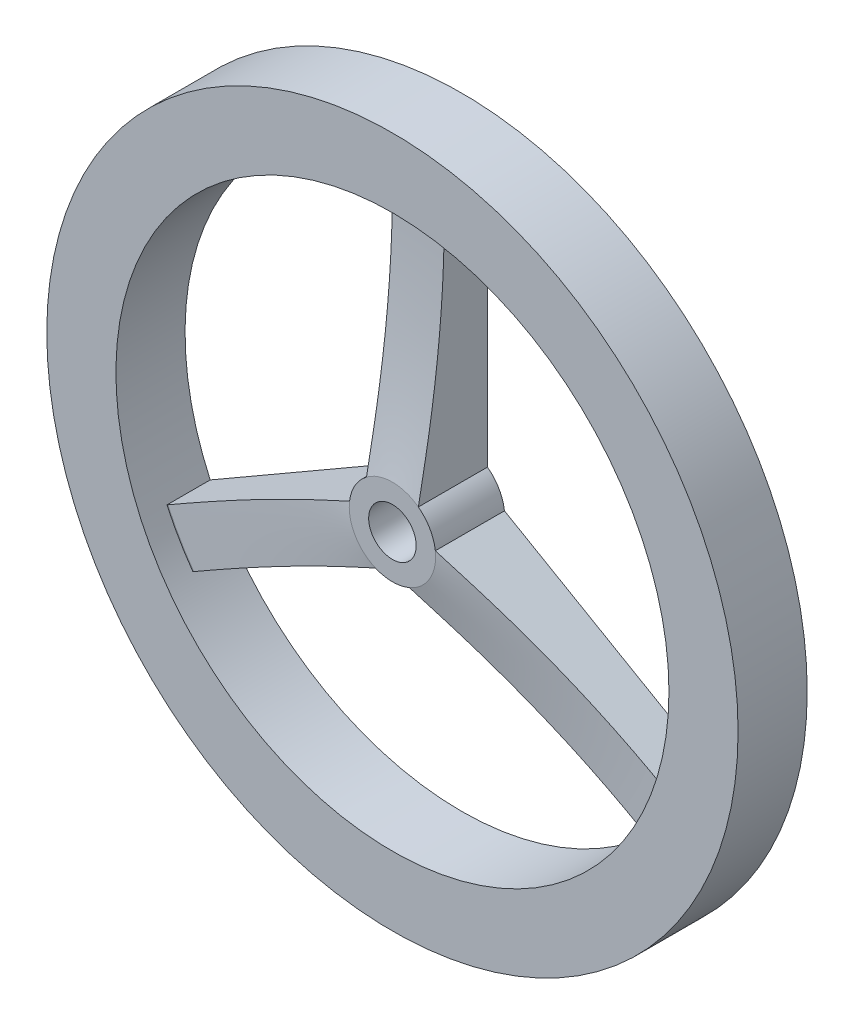
ISO-10303-21;
HEADER;
FILE_DESCRIPTION(('STEP AP214'),'2;1');
FILE_NAME('part.step','',(''),(''),'','','');
FILE_SCHEMA(('AUTOMOTIVE_DESIGN { 1 0 10303 214 1 1 1 1 }'));
ENDSEC;
DATA;
#1=APPLICATION_CONTEXT('core data for automotive mechanical design processes');
#2=APPLICATION_PROTOCOL_DEFINITION('international standard','automotive_design',2000,#1);
#3=PRODUCT_CONTEXT('',#1,'mechanical');
#4=PRODUCT('Part','Part','',(#3));
#5=PRODUCT_RELATED_PRODUCT_CATEGORY('part','',(#4));
#6=PRODUCT_DEFINITION_FORMATION('','',#4);
#7=PRODUCT_DEFINITION_CONTEXT('part definition',#1,'design');
#8=PRODUCT_DEFINITION('design','',#6,#7);
#9=PRODUCT_DEFINITION_SHAPE('','',#8);
#10=(LENGTH_UNIT() NAMED_UNIT(*) SI_UNIT(.MILLI.,.METRE.));
#11=(NAMED_UNIT(*) PLANE_ANGLE_UNIT() SI_UNIT($,.RADIAN.));
#12=(NAMED_UNIT(*) SI_UNIT($,.STERADIAN.) SOLID_ANGLE_UNIT());
#13=UNCERTAINTY_MEASURE_WITH_UNIT(LENGTH_MEASURE(1.E-05),#10,'distance_accuracy_value','');
#14=(GEOMETRIC_REPRESENTATION_CONTEXT(3) GLOBAL_UNCERTAINTY_ASSIGNED_CONTEXT((#13)) GLOBAL_UNIT_ASSIGNED_CONTEXT((#10,
#11,#12)) REPRESENTATION_CONTEXT('',''));
#15=CARTESIAN_POINT('',(0.,0.,0.));
#16=DIRECTION('',(0.,0.,1.));
#17=DIRECTION('',(1.,0.,0.));
#18=AXIS2_PLACEMENT_3D('',#15,#16,#17);
#19=CARTESIAN_POINT('',(0.,0.,4.));
#20=DIRECTION('',(0.,0.,-1.));
#21=DIRECTION('',(-1.,0.,0.));
#22=AXIS2_PLACEMENT_3D('',#19,#20,#21);
#23=CYLINDRICAL_SURFACE('',#22,5.);
#24=CARTESIAN_POINT('',(0.,0.,4.));
#25=DIRECTION('',(0.,0.,1.));
#26=DIRECTION('',(1.,0.,0.));
#27=AXIS2_PLACEMENT_3D('',#24,#25,#26);
#28=CIRCLE('',#27,5.);
#29=CARTESIAN_POINT('',(-1.96410161513775,-4.59807621135332,4.));
#30=VERTEX_POINT('',#29);
#31=CARTESIAN_POINT('',(1.96410161513776,-4.59807621135332,4.));
#32=VERTEX_POINT('',#31);
#33=EDGE_CURVE('E300',#30,#32,#28,.T.);
#34=ORIENTED_EDGE('',*,*,#33,.F.);
#35=DIRECTION('',(0.,0.,-1.));
#36=VECTOR('',#35,1.);
#37=CARTESIAN_POINT('',(-1.96410161513775,-4.59807621135332,4.));
#38=LINE('',#37,#36);
#39=CARTESIAN_POINT('',(-1.96410161513775,-4.59807621135332,-4.));
#40=VERTEX_POINT('',#39);
#41=EDGE_CURVE('E303',#30,#40,#38,.T.);
#42=ORIENTED_EDGE('',*,*,#41,.T.);
#43=CARTESIAN_POINT('',(0.,0.,-4.));
#44=DIRECTION('',(0.,0.,1.));
#45=DIRECTION('',(1.,0.,0.));
#46=AXIS2_PLACEMENT_3D('',#43,#44,#45);
#47=CIRCLE('',#46,5.);
#48=CARTESIAN_POINT('',(1.96410161513776,-4.59807621135332,-4.));
#49=VERTEX_POINT('',#48);
#50=EDGE_CURVE('E349',#40,#49,#47,.T.);
#51=ORIENTED_EDGE('',*,*,#50,.T.);
#52=DIRECTION('',(0.,0.,-1.));
#53=VECTOR('',#52,1.);
#54=CARTESIAN_POINT('',(1.96410161513776,-4.59807621135332,4.));
#55=LINE('',#54,#53);
#56=EDGE_CURVE('E305',#32,#49,#55,.T.);
#57=ORIENTED_EDGE('',*,*,#56,.F.);
#58=EDGE_LOOP('',(#34,#42,#51,#57));
#59=FACE_BOUND('',#58,.T.);
#60=ADVANCED_FACE('F35',(#59),#23,.T.);
#61=CARTESIAN_POINT('',(4.96410161513775,0.598076211353317,4.));
#62=VERTEX_POINT('',#61);
#63=CARTESIAN_POINT('',(3.,4.,4.));
#64=VERTEX_POINT('',#63);
#65=EDGE_CURVE('E334',#62,#64,#28,.T.);
#66=ORIENTED_EDGE('',*,*,#65,.F.);
#67=DIRECTION('',(0.,0.,-1.));
#68=VECTOR('',#67,1.);
#69=CARTESIAN_POINT('',(4.96410161513776,0.598076211353317,4.));
#70=LINE('',#69,#68);
#71=CARTESIAN_POINT('',(4.96410161513776,0.598076211353317,-4.));
#72=VERTEX_POINT('',#71);
#73=EDGE_CURVE('E184',#62,#72,#70,.T.);
#74=ORIENTED_EDGE('',*,*,#73,.T.);
#75=CARTESIAN_POINT('',(3.,4.,-4.));
#76=VERTEX_POINT('',#75);
#77=EDGE_CURVE('E345',#72,#76,#47,.T.);
#78=ORIENTED_EDGE('',*,*,#77,.T.);
#79=DIRECTION('',(0.,0.,-1.));
#80=VECTOR('',#79,1.);
#81=CARTESIAN_POINT('',(3.,4.,4.));
#82=LINE('',#81,#80);
#83=EDGE_CURVE('E181',#64,#76,#82,.T.);
#84=ORIENTED_EDGE('',*,*,#83,.F.);
#85=EDGE_LOOP('',(#66,#74,#78,#84));
#86=FACE_BOUND('',#85,.T.);
#87=ADVANCED_FACE('F255',(#86),#23,.T.);
#88=CARTESIAN_POINT('',(-1.5,2.59807621135332,4.));
#89=DIRECTION('',(0.5,-0.866025403784438,0.));
#90=DIRECTION('',(0.866025403784438,0.5,0.));
#91=AXIS2_PLACEMENT_3D('',#88,#89,#90);
#92=PLANE('',#91);
#93=DIRECTION('',(-0.866025403784438,-0.5,0.));
#94=VECTOR('',#93,1.);
#95=CARTESIAN_POINT('',(-1.5,2.59807621135332,1.));
#96=LINE('',#95,#94);
#97=CARTESIAN_POINT('',(-28.9939074141205,-13.2755386352638,1.));
#98=VERTEX_POINT('',#97);
#99=CARTESIAN_POINT('',(-29.0907593226428,-13.3314561107207,1.));
#100=VERTEX_POINT('',#99);
#101=EDGE_CURVE('E327',#98,#100,#96,.T.);
#102=ORIENTED_EDGE('',*,*,#101,.F.);
#103=CARTESIAN_POINT('',(-28.9939074141205,-13.2755386352638,1.));
#104=CARTESIAN_POINT('',(-27.8443864046285,-12.6118623709945,0.999964322601765));
#105=CARTESIAN_POINT('',(-26.6948359666761,-11.9481691161956,1.02146592758871));
#106=CARTESIAN_POINT('',(-24.3963586813584,-10.6211426367912,1.10720918337995));
#107=CARTESIAN_POINT('',(-23.2474324264521,-9.95780975424201,1.17147203644057));
#108=CARTESIAN_POINT('',(-21.5270247813375,-8.96453193721919,1.29958471977932));
#109=CARTESIAN_POINT('',(-20.9546236807934,-8.63405600773563,1.3475115982272));
#110=CARTESIAN_POINT('',(-19.8105456777323,-7.97352226469439,1.45384292490937));
#111=CARTESIAN_POINT('',(-19.2388687766941,-7.64346445199049,1.51224739450387));
#112=CARTESIAN_POINT('',(-18.0965624915049,-6.98395361073948,1.63941075175304));
#113=CARTESIAN_POINT('',(-17.5259328347061,-6.6545004247791,1.70816638096561));
#114=CARTESIAN_POINT('',(-16.3856687390307,-5.99616864219364,1.85589612935304));
#115=CARTESIAN_POINT('',(-15.8160342969269,-5.66729004370533,1.93487021532987));
#116=CARTESIAN_POINT('',(-14.6695617311205,-5.0053737992185,2.10404585566032));
#117=CARTESIAN_POINT('',(-14.0927399035108,-4.67234556177361,2.19439454097784));
#118=CARTESIAN_POINT('',(-12.9403360401385,-4.00700488104043,2.38502846339841));
#119=CARTESIAN_POINT('',(-12.3647539943644,-3.67469243197204,2.48531361995322));
#120=CARTESIAN_POINT('',(-11.2147309145626,-3.01072629727421,2.69526751298077));
#121=CARTESIAN_POINT('',(-10.6402901978935,-2.67907279487179,2.80493856378334));
#122=CARTESIAN_POINT('',(-9.7795303368205,-2.18211285737368,2.97564070223175));
#123=CARTESIAN_POINT('',(-9.49274701977314,-2.01653843207729,3.03357690041073));
#124=CARTESIAN_POINT('',(-8.91946156406663,-1.68555191990264,3.1512759482476));
#125=CARTESIAN_POINT('',(-8.63295942535432,-1.52013983299368,3.21103879756014));
#126=CARTESIAN_POINT('',(-8.05920785883902,-1.1888842116181,3.33226878015223));
#127=CARTESIAN_POINT('',(-7.77195925053199,-1.0230411502877,3.39374106876742));
#128=CARTESIAN_POINT('',(-7.19763997189639,-0.691457760166637,3.51767732560235));
#129=CARTESIAN_POINT('',(-6.91056929232295,-0.525717426038463,3.58014123685118));
#130=CARTESIAN_POINT('',(-6.33662307150029,-0.194349420946132,3.70521268710344));
#131=CARTESIAN_POINT('',(-6.04974751298307,-0.0287217400122904,3.76782012283082));
#132=CARTESIAN_POINT('',(-5.47574347093246,0.302679648181564,3.89190483667621));
#133=CARTESIAN_POINT('',(-5.188614945204,0.46845337980291,3.95338185911));
#134=CARTESIAN_POINT('',(-4.75730588702721,0.717469780645203,4.04299897580777));
#135=CARTESIAN_POINT('',(-4.61333210381037,0.800593083141695,4.07245806353891));
#136=CARTESIAN_POINT('',(-4.32518268428294,0.96695622807269,4.13002441067155));
#137=CARTESIAN_POINT('',(-4.18100705056943,1.05019606900777,4.15813168730437));
#138=CARTESIAN_POINT('',(-3.89247141835255,1.21678219393898,4.21238689866559));
#139=CARTESIAN_POINT('',(-3.74811159563013,1.30012837644794,4.23853606924588));
#140=CARTESIAN_POINT('',(-3.45903241259483,1.46702832059049,4.28811967346319));
#141=CARTESIAN_POINT('',(-3.31431303730816,1.5505820908692,4.31155399203495));
#142=CARTESIAN_POINT('',(-3.02408124830716,1.71814749237632,4.35479166006168));
#143=CARTESIAN_POINT('',(-2.87856775184527,1.80215974872931,4.37458548413092));
#144=CARTESIAN_POINT('',(-2.58712305501283,1.97042542289941,4.40933278702987));
#145=CARTESIAN_POINT('',(-2.44119192536401,2.0546787998853,4.42428704151511));
#146=CARTESIAN_POINT('',(-2.14861470537282,2.22359833660597,4.44825435536198));
#147=CARTESIAN_POINT('',(-2.00196774350172,2.30826499951809,4.45725378781134));
#148=CARTESIAN_POINT('',(-1.78181337830201,2.43537118152942,4.46564148117469));
#149=CARTESIAN_POINT('',(-1.70837507529438,2.4777708055397,4.46758527850285));
#150=CARTESIAN_POINT('',(-1.56147564944696,2.56258322859651,4.46973163153722));
#151=CARTESIAN_POINT('',(-1.48801452561484,2.60499602821595,4.46993409620178));
#152=CARTESIAN_POINT('',(-1.41455749481462,2.64740646472233,4.46924842967698));
#153=B_SPLINE_CURVE_WITH_KNOTS('',3,(#103,#104,#105,#106,#107,#108,#109,#110,#111,#112,#113,
#114,#115,#116,#117,#118,#119,#120,#121,#122,#123,#124,#125,#126,#127,#128,#129,#130,#131,#132,
#133,#134,#135,#136,#137,#138,#139,#140,#141,#142,#143,#144,#145,#146,#147,#148,#149,#150,#151,
#152),.UNSPECIFIED.,.F.,.F.,(4,2,2,2,2,2,2,2,2,2,2,2,2,2,2,2,2,2,2,2,2,2,2,2,4),(0.,
3.98195598674578,7.96588781442186,9.95388001725605,11.9418762729704,13.9292480307077,
15.9166133319714,17.9330039779424,19.9493782797353,21.966251210086,22.9747832429203,
23.9833150850838,24.9953161273995,26.0072592369555,27.018620300921,28.0302073749373,
28.5367132435319,29.0432126540616,29.549389646665,30.0555880850395,30.5630927173844,
31.0705159697739,31.5790964215351,31.8335449146992,32.0880067110495),.UNSPECIFIED.);
#154=CARTESIAN_POINT('',(-4.96410161513775,0.598076211353315,4.));
#155=VERTEX_POINT('',#154);
#156=EDGE_CURVE('E206',#98,#155,#153,.T.);
#157=ORIENTED_EDGE('',*,*,#156,.T.);
#158=DIRECTION('',(0.,0.,-1.));
#159=VECTOR('',#158,1.);
#160=CARTESIAN_POINT('',(-4.96410161513776,0.598076211353314,4.));
#161=LINE('',#160,#159);
#162=CARTESIAN_POINT('',(-4.96410161513776,0.598076211353314,-4.));
#163=VERTEX_POINT('',#162);
#164=EDGE_CURVE('E195',#155,#163,#161,.T.);
#165=ORIENTED_EDGE('',*,*,#164,.T.);
#166=DIRECTION('',(-0.866025403784438,-0.5,0.));
#167=VECTOR('',#166,1.);
#168=CARTESIAN_POINT('',(-1.5,2.59807621135332,-4.));
#169=LINE('',#168,#167);
#170=CARTESIAN_POINT('',(-29.0907593226428,-13.3314561107207,-4.));
#171=VERTEX_POINT('',#170);
#172=EDGE_CURVE('E361',#163,#171,#169,.T.);
#173=ORIENTED_EDGE('',*,*,#172,.T.);
#174=DIRECTION('',(0.,0.,-1.));
#175=VECTOR('',#174,1.);
#176=CARTESIAN_POINT('',(-29.0907593226428,-13.3314561107207,4.));
#177=LINE('',#176,#175);
#178=EDGE_CURVE('E373',#100,#171,#177,.T.);
#179=ORIENTED_EDGE('',*,*,#178,.F.);
#180=EDGE_LOOP('',(#102,#157,#165,#173,#179));
#181=FACE_BOUND('',#180,.T.);
#182=ADVANCED_FACE('F256',(#181),#92,.F.);
#183=CARTESIAN_POINT('',(1.5,-2.59807621135332,4.));
#184=DIRECTION('',(0.5,-0.866025403784438,0.));
#185=DIRECTION('',(0.866025403784438,0.5,0.));
#186=AXIS2_PLACEMENT_3D('',#183,#184,#185);
#187=PLANE('',#186);
#188=ORIENTED_EDGE('',*,*,#41,.F.);
#189=CARTESIAN_POINT('',(-25.9939074141205,-18.4716910579704,1.));
#190=CARTESIAN_POINT('',(-24.8443864046285,-17.8080147937011,0.999964322601765));
#191=CARTESIAN_POINT('',(-23.6948359666761,-17.1443215389023,1.02146592758871));
#192=CARTESIAN_POINT('',(-21.3963586813584,-15.8172950594978,1.10720918337995));
#193=CARTESIAN_POINT('',(-20.2474324264521,-15.1539621769486,1.17147203644057));
#194=CARTESIAN_POINT('',(-18.5270247813375,-14.1606843599258,1.29958471977931));
#195=CARTESIAN_POINT('',(-17.9546236807934,-13.8302084304423,1.3475115982272));
#196=CARTESIAN_POINT('',(-16.8105456777323,-13.169674687401,1.45384292490937));
#197=CARTESIAN_POINT('',(-16.2388687766941,-12.8396168746971,1.51224739450387));
#198=CARTESIAN_POINT('',(-15.0965624915049,-12.1801060334461,1.63941075175304));
#199=CARTESIAN_POINT('',(-14.5259328347061,-11.8506528474857,1.70816638096561));
#200=CARTESIAN_POINT('',(-13.3856687390306,-11.1923210649003,1.85589612935304));
#201=CARTESIAN_POINT('',(-12.8160342969269,-10.863442466412,1.93487021532986));
#202=CARTESIAN_POINT('',(-11.6695617311205,-10.2015262219251,2.10404585566032));
#203=CARTESIAN_POINT('',(-11.0927399035108,-9.86849798448024,2.19439454097783));
#204=CARTESIAN_POINT('',(-9.9403360401385,-9.20315730374706,2.38502846339841));
#205=CARTESIAN_POINT('',(-9.36475399436441,-8.87084485467867,2.48531361995323));
#206=CARTESIAN_POINT('',(-8.21473091456264,-8.20687871998084,2.69526751298077));
#207=CARTESIAN_POINT('',(-7.64029019789349,-7.87522521757842,2.80493856378333));
#208=CARTESIAN_POINT('',(-6.7795303368205,-7.37826528008031,2.97564070223174));
#209=CARTESIAN_POINT('',(-6.49274701977314,-7.21269085478392,3.03357690041073));
#210=CARTESIAN_POINT('',(-5.91946156406662,-6.88170434260927,3.1512759482476));
#211=CARTESIAN_POINT('',(-5.63295942535432,-6.71629225570031,3.21103879756015));
#212=CARTESIAN_POINT('',(-5.05920785883902,-6.38503663432474,3.33226878015223));
#213=CARTESIAN_POINT('',(-4.77195925053199,-6.21919357299433,3.39374106876741));
#214=CARTESIAN_POINT('',(-4.19763997189638,-5.88761018287327,3.51767732560234));
#215=CARTESIAN_POINT('',(-3.91056929232294,-5.72186984874509,3.58014123685118));
#216=CARTESIAN_POINT('',(-3.33662307150028,-5.39050184365276,3.70521268710345));
#217=CARTESIAN_POINT('',(-3.04974751298306,-5.22487416271892,3.76782012283082));
#218=CARTESIAN_POINT('',(-2.47574347093245,-4.89347277452507,3.89190483667622));
#219=CARTESIAN_POINT('',(-2.18861494520399,-4.72769904290372,3.95338185911001));
#220=CARTESIAN_POINT('',(-1.7573058870272,-4.47868264206143,4.04299897580777));
#221=CARTESIAN_POINT('',(-1.61333210381036,-4.39555933956494,4.07245806353891));
#222=CARTESIAN_POINT('',(-1.32518268428293,-4.22919619463394,4.13002441067154));
#223=CARTESIAN_POINT('',(-1.18100705056943,-4.14595635369886,4.15813168730436));
#224=CARTESIAN_POINT('',(-0.892471418352548,-3.97937022876765,4.2123868986656));
#225=CARTESIAN_POINT('',(-0.748111595630123,-3.89602404625869,4.2385360692459));
#226=CARTESIAN_POINT('',(-0.45903241259483,-3.72912410211614,4.2881196734632));
#227=CARTESIAN_POINT('',(-0.314313037308161,-3.64557033183743,4.31155399203495));
#228=CARTESIAN_POINT('',(-0.0240812483071525,-3.47800493033031,4.35479166006167));
#229=CARTESIAN_POINT('',(0.121432248154729,-3.39399267397732,4.37458548413093));
#230=CARTESIAN_POINT('',(0.41287694498717,-3.22572699980722,4.40933278702987));
#231=CARTESIAN_POINT('',(0.558808074635994,-3.14147362282133,4.4242870415151));
#232=CARTESIAN_POINT('',(0.851385294627184,-2.97255408610066,4.44825435536198));
#233=CARTESIAN_POINT('',(0.998032256498276,-2.88788742318855,4.45725378781135));
#234=CARTESIAN_POINT('',(1.21818662169799,-2.76078124117722,4.46564148117469));
#235=CARTESIAN_POINT('',(1.29162492470562,-2.71838161716693,4.46758527850284));
#236=CARTESIAN_POINT('',(1.43852435055304,-2.63356919411013,4.46973163153722));
#237=CARTESIAN_POINT('',(1.51198547438516,-2.59115639449068,4.46993409620178));
#238=CARTESIAN_POINT('',(1.58544250518538,-2.5487459579843,4.46924842967699));
#239=B_SPLINE_CURVE_WITH_KNOTS('',3,(#189,#190,#191,#192,#193,#194,#195,#196,#197,#198,#199,
#200,#201,#202,#203,#204,#205,#206,#207,#208,#209,#210,#211,#212,#213,#214,#215,#216,#217,#218,
#219,#220,#221,#222,#223,#224,#225,#226,#227,#228,#229,#230,#231,#232,#233,#234,#235,#236,#237,
#238),.UNSPECIFIED.,.F.,.F.,(4,2,2,2,2,2,2,2,2,2,2,2,2,2,2,2,2,2,2,2,2,2,2,2,4),(0.,
3.98195598674578,7.96588781442186,9.95388001725605,11.9418762729704,13.9292480307077,
15.9166133319714,17.9330039779424,19.9493782797354,21.966251210086,22.9747832429203,
23.9833150850838,24.9953161273995,26.0072592369555,27.018620300921,28.0302073749373,
28.5367132435319,29.0432126540616,29.549389646665,30.0555880850395,30.5630927173844,
31.0705159697739,31.5790964215351,31.8335449146992,32.0880067110495),.UNSPECIFIED.);
#240=CARTESIAN_POINT('',(-25.9939074141205,-18.4716910579704,1.));
#241=VERTEX_POINT('',#240);
#242=EDGE_CURVE('E198',#30,#241,#239,.F.);
#243=ORIENTED_EDGE('',*,*,#242,.T.);
#244=DIRECTION('',(-0.866025403784438,-0.5,0.));
#245=VECTOR('',#244,1.);
#246=CARTESIAN_POINT('',(1.5,-2.59807621135332,1.));
#247=LINE('',#246,#245);
#248=CARTESIAN_POINT('',(-26.0907593226428,-18.5276085334273,1.));
#249=VERTEX_POINT('',#248);
#250=EDGE_CURVE('E322',#241,#249,#247,.T.);
#251=ORIENTED_EDGE('',*,*,#250,.T.);
#252=DIRECTION('',(0.,0.,-1.));
#253=VECTOR('',#252,1.);
#254=CARTESIAN_POINT('',(-26.0907593226428,-18.5276085334273,4.));
#255=LINE('',#254,#253);
#256=CARTESIAN_POINT('',(-26.0907593226428,-18.5276085334273,-4.));
#257=VERTEX_POINT('',#256);
#258=EDGE_CURVE('E191',#249,#257,#255,.T.);
#259=ORIENTED_EDGE('',*,*,#258,.T.);
#260=DIRECTION('',(-0.866025403784438,-0.5,0.));
#261=VECTOR('',#260,1.);
#262=CARTESIAN_POINT('',(1.5,-2.59807621135332,-4.));
#263=LINE('',#262,#261);
#264=EDGE_CURVE('E353',#40,#257,#263,.T.);
#265=ORIENTED_EDGE('',*,*,#264,.F.);
#266=EDGE_LOOP('',(#188,#243,#251,#259,#265));
#267=FACE_BOUND('',#266,.T.);
#268=ADVANCED_FACE('F213',(#267),#187,.T.);
#269=CARTESIAN_POINT('',(-1.5,-2.59807621135332,4.));
#270=DIRECTION('',(0.5,0.866025403784439,0.));
#271=DIRECTION('',(-0.866025403784439,0.5,0.));
#272=AXIS2_PLACEMENT_3D('',#269,#270,#271);
#273=PLANE('',#272);
#274=DIRECTION('',(0.866025403784439,-0.5,0.));
#275=VECTOR('',#274,1.);
#276=CARTESIAN_POINT('',(-1.5,-2.59807621135332,1.));
#277=LINE('',#276,#275);
#278=CARTESIAN_POINT('',(25.9939074141205,-18.4716910579704,1.));
#279=VERTEX_POINT('',#278);
#280=CARTESIAN_POINT('',(26.0907593226428,-18.5276085334273,1.));
#281=VERTEX_POINT('',#280);
#282=EDGE_CURVE('E328',#279,#281,#277,.T.);
#283=ORIENTED_EDGE('',*,*,#282,.F.);
#284=CARTESIAN_POINT('',(25.9939074141205,-18.4716910579704,1.));
#285=CARTESIAN_POINT('',(24.8443864046285,-17.8080147937011,0.999964322601765));
#286=CARTESIAN_POINT('',(23.6948359666761,-17.1443215389022,1.02146592758871));
#287=CARTESIAN_POINT('',(21.3963586813584,-15.8172950594978,1.10720918337995));
#288=CARTESIAN_POINT('',(20.2474324264521,-15.1539621769486,1.17147203644057));
#289=CARTESIAN_POINT('',(18.5270247813375,-14.1606843599258,1.29958471977932));
#290=CARTESIAN_POINT('',(17.9546236807934,-13.8302084304422,1.3475115982272));
#291=CARTESIAN_POINT('',(16.8105456777323,-13.169674687401,1.45384292490937));
#292=CARTESIAN_POINT('',(16.2388687766941,-12.8396168746971,1.51224739450387));
#293=CARTESIAN_POINT('',(15.0965624915049,-12.1801060334461,1.63941075175304));
#294=CARTESIAN_POINT('',(14.5259328347061,-11.8506528474857,1.70816638096561));
#295=CARTESIAN_POINT('',(13.3856687390307,-11.1923210649003,1.85589612935305));
#296=CARTESIAN_POINT('',(12.8160342969269,-10.8634424664119,1.93487021532987));
#297=CARTESIAN_POINT('',(11.6695617311205,-10.2015262219251,2.10404585566032));
#298=CARTESIAN_POINT('',(11.0927399035108,-9.86849798448023,2.19439454097784));
#299=CARTESIAN_POINT('',(9.9403360401385,-9.20315730374706,2.38502846339841));
#300=CARTESIAN_POINT('',(9.36475399436441,-8.87084485467867,2.48531361995323));
#301=CARTESIAN_POINT('',(8.21473091456264,-8.20687871998084,2.69526751298077));
#302=CARTESIAN_POINT('',(7.64029019789349,-7.87522521757842,2.80493856378333));
#303=CARTESIAN_POINT('',(6.7795303368205,-7.3782652800803,2.97564070223175));
#304=CARTESIAN_POINT('',(6.49274701977315,-7.21269085478392,3.03357690041073));
#305=CARTESIAN_POINT('',(5.91946156406663,-6.88170434260927,3.15127594824761));
#306=CARTESIAN_POINT('',(5.63295942535432,-6.71629225570031,3.21103879756015));
#307=CARTESIAN_POINT('',(5.05920785883902,-6.38503663432473,3.33226878015223));
#308=CARTESIAN_POINT('',(4.77195925053199,-6.21919357299433,3.39374106876742));
#309=CARTESIAN_POINT('',(4.19763997189639,-5.88761018287326,3.51767732560234));
#310=CARTESIAN_POINT('',(3.91056929232295,-5.72186984874509,3.58014123685118));
#311=CARTESIAN_POINT('',(3.33662307150029,-5.39050184365276,3.70521268710345));
#312=CARTESIAN_POINT('',(3.04974751298307,-5.22487416271892,3.76782012283082));
#313=CARTESIAN_POINT('',(2.47574347093246,-4.89347277452507,3.8919048366762));
#314=CARTESIAN_POINT('',(2.188614945204,-4.72769904290372,3.95338185910999));
#315=CARTESIAN_POINT('',(1.75730588702721,-4.47868264206143,4.04299897580776));
#316=CARTESIAN_POINT('',(1.61333210381037,-4.39555933956494,4.07245806353891));
#317=CARTESIAN_POINT('',(1.32518268428294,-4.22919619463394,4.13002441067155));
#318=CARTESIAN_POINT('',(1.18100705056943,-4.14595635369886,4.15813168730438));
#319=CARTESIAN_POINT('',(0.892471418352555,-3.97937022876765,4.2123868986656));
#320=CARTESIAN_POINT('',(0.748111595630129,-3.89602404625869,4.23853606924589));
#321=CARTESIAN_POINT('',(0.459032412594835,-3.72912410211615,4.28811967346319));
#322=CARTESIAN_POINT('',(0.314313037308167,-3.64557033183743,4.31155399203495));
#323=CARTESIAN_POINT('',(0.0240812483071588,-3.47800493033032,4.35479166006168));
#324=CARTESIAN_POINT('',(-0.121432248154723,-3.39399267397732,4.37458548413093));
#325=CARTESIAN_POINT('',(-0.412876944987164,-3.22572699980723,4.40933278702988));
#326=CARTESIAN_POINT('',(-0.558808074635987,-3.14147362282133,4.42428704151511));
#327=CARTESIAN_POINT('',(-0.851385294627177,-2.97255408610067,4.44825435536198));
#328=CARTESIAN_POINT('',(-0.99803225649827,-2.88788742318855,4.45725378781136));
#329=CARTESIAN_POINT('',(-1.21818662169799,-2.76078124117722,4.4656414811747));
#330=CARTESIAN_POINT('',(-1.29162492470562,-2.71838161716694,4.46758527850285));
#331=CARTESIAN_POINT('',(-1.43852435055303,-2.63356919411013,4.46973163153722));
#332=CARTESIAN_POINT('',(-1.51198547438516,-2.59115639449068,4.46993409620178));
#333=CARTESIAN_POINT('',(-1.58544250518538,-2.5487459579843,4.46924842967699));
#334=B_SPLINE_CURVE_WITH_KNOTS('',3,(#284,#285,#286,#287,#288,#289,#290,#291,#292,#293,#294,
#295,#296,#297,#298,#299,#300,#301,#302,#303,#304,#305,#306,#307,#308,#309,#310,#311,#312,#313,
#314,#315,#316,#317,#318,#319,#320,#321,#322,#323,#324,#325,#326,#327,#328,#329,#330,#331,#332,
#333),.UNSPECIFIED.,.F.,.F.,(4,2,2,2,2,2,2,2,2,2,2,2,2,2,2,2,2,2,2,2,2,2,2,2,4),(0.,
3.98195598674578,7.96588781442185,9.95388001725605,11.9418762729704,13.9292480307077,
15.9166133319714,17.9330039779424,19.9493782797353,21.966251210086,22.9747832429203,
23.9833150850838,24.9953161273995,26.0072592369555,27.018620300921,28.0302073749373,
28.5367132435319,29.0432126540616,29.549389646665,30.0555880850395,30.5630927173844,
31.0705159697739,31.579096421535,31.8335449146992,32.0880067110494),.UNSPECIFIED.);
#335=EDGE_CURVE('E235',#279,#32,#334,.T.);
#336=ORIENTED_EDGE('',*,*,#335,.T.);
#337=ORIENTED_EDGE('',*,*,#56,.T.);
#338=DIRECTION('',(0.866025403784439,-0.5,0.));
#339=VECTOR('',#338,1.);
#340=CARTESIAN_POINT('',(-1.5,-2.59807621135332,-4.));
#341=LINE('',#340,#339);
#342=CARTESIAN_POINT('',(26.0907593226428,-18.5276085334273,-4.));
#343=VERTEX_POINT('',#342);
#344=EDGE_CURVE('E358',#49,#343,#341,.T.);
#345=ORIENTED_EDGE('',*,*,#344,.T.);
#346=DIRECTION('',(0.,0.,-1.));
#347=VECTOR('',#346,1.);
#348=CARTESIAN_POINT('',(26.0907593226428,-18.5276085334273,4.));
#349=LINE('',#348,#347);
#350=EDGE_CURVE('E377',#281,#343,#349,.T.);
#351=ORIENTED_EDGE('',*,*,#350,.F.);
#352=EDGE_LOOP('',(#283,#336,#337,#345,#351));
#353=FACE_BOUND('',#352,.T.);
#354=ADVANCED_FACE('F246',(#353),#273,.F.);
#355=CARTESIAN_POINT('',(1.5,2.59807621135332,4.));
#356=DIRECTION('',(0.5,0.866025403784439,0.));
#357=DIRECTION('',(-0.866025403784439,0.5,0.));
#358=AXIS2_PLACEMENT_3D('',#355,#356,#357);
#359=PLANE('',#358);
#360=ORIENTED_EDGE('',*,*,#73,.F.);
#361=CARTESIAN_POINT('',(28.9939074141205,-13.2755386352638,1.));
#362=CARTESIAN_POINT('',(27.8443864046285,-12.6118623709944,0.999964322601764));
#363=CARTESIAN_POINT('',(26.6948359666761,-11.9481691161956,1.02146592758871));
#364=CARTESIAN_POINT('',(24.3963586813584,-10.6211426367912,1.10720918337995));
#365=CARTESIAN_POINT('',(23.2474324264521,-9.95780975424199,1.17147203644057));
#366=CARTESIAN_POINT('',(21.5270247813375,-8.96453193721918,1.29958471977932));
#367=CARTESIAN_POINT('',(20.9546236807934,-8.63405600773562,1.3475115982272));
#368=CARTESIAN_POINT('',(19.8105456777323,-7.97352226469438,1.45384292490937));
#369=CARTESIAN_POINT('',(19.2388687766941,-7.64346445199048,1.51224739450387));
#370=CARTESIAN_POINT('',(18.0965624915049,-6.98395361073947,1.63941075175304));
#371=CARTESIAN_POINT('',(17.5259328347061,-6.65450042477909,1.70816638096561));
#372=CARTESIAN_POINT('',(16.3856687390307,-5.99616864219363,1.85589612935304));
#373=CARTESIAN_POINT('',(15.8160342969269,-5.66729004370532,1.93487021532987));
#374=CARTESIAN_POINT('',(14.6695617311205,-5.0053737992185,2.10404585566032));
#375=CARTESIAN_POINT('',(14.0927399035108,-4.6723455617736,2.19439454097783));
#376=CARTESIAN_POINT('',(12.9403360401385,-4.00700488104042,2.38502846339841));
#377=CARTESIAN_POINT('',(12.3647539943644,-3.67469243197203,2.48531361995323));
#378=CARTESIAN_POINT('',(11.2147309145626,-3.0107262972742,2.69526751298077));
#379=CARTESIAN_POINT('',(10.6402901978935,-2.67907279487179,2.80493856378333));
#380=CARTESIAN_POINT('',(9.7795303368205,-2.18211285737367,2.97564070223174));
#381=CARTESIAN_POINT('',(9.49274701977315,-2.01653843207729,3.03357690041073));
#382=CARTESIAN_POINT('',(8.91946156406663,-1.68555191990263,3.1512759482476));
#383=CARTESIAN_POINT('',(8.63295942535432,-1.52013983299368,3.21103879756015));
#384=CARTESIAN_POINT('',(8.05920785883902,-1.1888842116181,3.33226878015223));
#385=CARTESIAN_POINT('',(7.77195925053199,-1.02304115028769,3.39374106876741));
#386=CARTESIAN_POINT('',(7.19763997189639,-0.691457760166631,3.51767732560234));
#387=CARTESIAN_POINT('',(6.91056929232295,-0.525717426038459,3.58014123685118));
#388=CARTESIAN_POINT('',(6.33662307150029,-0.194349420946129,3.70521268710345));
#389=CARTESIAN_POINT('',(6.04974751298307,-0.0287217400122874,3.76782012283082));
#390=CARTESIAN_POINT('',(5.47574347093246,0.302679648181567,3.89190483667622));
#391=CARTESIAN_POINT('',(5.188614945204,0.468453379802913,3.95338185911001));
#392=CARTESIAN_POINT('',(4.75730588702721,0.717469780645206,4.04299897580777));
#393=CARTESIAN_POINT('',(4.61333210381037,0.800593083141697,4.07245806353891));
#394=CARTESIAN_POINT('',(4.32518268428294,0.966956228072692,4.13002441067155));
#395=CARTESIAN_POINT('',(4.18100705056943,1.05019606900777,4.15813168730437));
#396=CARTESIAN_POINT('',(3.89247141835255,1.21678219393899,4.2123868986656));
#397=CARTESIAN_POINT('',(3.74811159563013,1.30012837644794,4.2385360692459));
#398=CARTESIAN_POINT('',(3.45903241259483,1.46702832059049,4.2881196734632));
#399=CARTESIAN_POINT('',(3.31431303730816,1.5505820908692,4.31155399203495));
#400=CARTESIAN_POINT('',(3.02408124830715,1.71814749237632,4.35479166006167));
#401=CARTESIAN_POINT('',(2.87856775184527,1.80215974872931,4.37458548413093));
#402=CARTESIAN_POINT('',(2.58712305501283,1.97042542289941,4.40933278702987));
#403=CARTESIAN_POINT('',(2.44119192536401,2.0546787998853,4.4242870415151));
#404=CARTESIAN_POINT('',(2.14861470537282,2.22359833660597,4.44825435536198));
#405=CARTESIAN_POINT('',(2.00196774350173,2.30826499951809,4.45725378781135));
#406=CARTESIAN_POINT('',(1.78181337830201,2.43537118152941,4.46564148117469));
#407=CARTESIAN_POINT('',(1.70837507529438,2.4777708055397,4.46758527850284));
#408=CARTESIAN_POINT('',(1.56147564944696,2.5625832285965,4.46973163153721));
#409=CARTESIAN_POINT('',(1.48801452561484,2.60499602821595,4.46993409620178));
#410=CARTESIAN_POINT('',(1.41455749481462,2.64740646472233,4.46924842967699));
#411=B_SPLINE_CURVE_WITH_KNOTS('',3,(#361,#362,#363,#364,#365,#366,#367,#368,#369,#370,#371,
#372,#373,#374,#375,#376,#377,#378,#379,#380,#381,#382,#383,#384,#385,#386,#387,#388,#389,#390,
#391,#392,#393,#394,#395,#396,#397,#398,#399,#400,#401,#402,#403,#404,#405,#406,#407,#408,#409,
#410),.UNSPECIFIED.,.F.,.F.,(4,2,2,2,2,2,2,2,2,2,2,2,2,2,2,2,2,2,2,2,2,2,2,2,4),(0.,
3.98195598674578,7.96588781442186,9.95388001725605,11.9418762729704,13.9292480307077,
15.9166133319714,17.9330039779424,19.9493782797354,21.966251210086,22.9747832429203,
23.9833150850838,24.9953161273995,26.0072592369555,27.018620300921,28.0302073749373,
28.5367132435319,29.0432126540616,29.549389646665,30.0555880850395,30.5630927173844,
31.0705159697739,31.5790964215351,31.8335449146992,32.0880067110495),.UNSPECIFIED.);
#412=CARTESIAN_POINT('',(28.9939074141205,-13.2755386352638,1.));
#413=VERTEX_POINT('',#412);
#414=EDGE_CURVE('E229',#62,#413,#411,.F.);
#415=ORIENTED_EDGE('',*,*,#414,.T.);
#416=DIRECTION('',(0.866025403784439,-0.5,0.));
#417=VECTOR('',#416,1.);
#418=CARTESIAN_POINT('',(1.5,2.59807621135332,1.));
#419=LINE('',#418,#417);
#420=CARTESIAN_POINT('',(29.0907593226428,-13.3314561107207,1.));
#421=VERTEX_POINT('',#420);
#422=EDGE_CURVE('E162',#413,#421,#419,.T.);
#423=ORIENTED_EDGE('',*,*,#422,.T.);
#424=DIRECTION('',(0.,0.,-1.));
#425=VECTOR('',#424,1.);
#426=CARTESIAN_POINT('',(29.0907593226428,-13.3314561107207,4.));
#427=LINE('',#426,#425);
#428=CARTESIAN_POINT('',(29.0907593226428,-13.3314561107207,-4.));
#429=VERTEX_POINT('',#428);
#430=EDGE_CURVE('E182',#421,#429,#427,.T.);
#431=ORIENTED_EDGE('',*,*,#430,.T.);
#432=DIRECTION('',(0.866025403784439,-0.5,0.));
#433=VECTOR('',#432,1.);
#434=CARTESIAN_POINT('',(1.5,2.59807621135332,-4.));
#435=LINE('',#434,#433);
#436=EDGE_CURVE('E330',#72,#429,#435,.T.);
#437=ORIENTED_EDGE('',*,*,#436,.F.);
#438=EDGE_LOOP('',(#360,#415,#423,#431,#437));
#439=FACE_BOUND('',#438,.T.);
#440=ADVANCED_FACE('F222',(#439),#359,.T.);
#441=CARTESIAN_POINT('',(3.,0.,4.));
#442=DIRECTION('',(-1.,0.,0.));
#443=DIRECTION('',(0.,0.,1.));
#444=AXIS2_PLACEMENT_3D('',#441,#442,#443);
#445=PLANE('',#444);
#446=DIRECTION('',(0.,1.,0.));
#447=VECTOR('',#446,1.);
#448=CARTESIAN_POINT('',(3.,0.,1.));
#449=LINE('',#448,#447);
#450=CARTESIAN_POINT('',(3.,31.7472296932342,1.));
#451=VERTEX_POINT('',#450);
#452=CARTESIAN_POINT('',(3.,31.859064644148,1.));
#453=VERTEX_POINT('',#452);
#454=EDGE_CURVE('E154',#451,#453,#449,.T.);
#455=ORIENTED_EDGE('',*,*,#454,.F.);
#456=CARTESIAN_POINT('',(3.,31.7472296932342,1.));
#457=CARTESIAN_POINT('',(3.,30.4198771646955,0.999964322601765));
#458=CARTESIAN_POINT('',(3.,29.0924906550979,1.02146592758871));
#459=CARTESIAN_POINT('',(3.,26.438437696289,1.10720918337995));
#460=CARTESIAN_POINT('',(3.,25.1117719311906,1.17147203644057));
#461=CARTESIAN_POINT('',(3.,23.125216297145,1.29958471977932));
#462=CARTESIAN_POINT('',(3.,22.4642644381779,1.3475115982272));
#463=CARTESIAN_POINT('',(3.,21.1431969520954,1.45384292490937));
#464=CARTESIAN_POINT('',(3.,20.4830813266876,1.51224739450387));
#465=CARTESIAN_POINT('',(3.,19.1640596441856,1.63941075175304));
#466=CARTESIAN_POINT('',(3.,18.5051532722648,1.70816638096561));
#467=CARTESIAN_POINT('',(3.,17.1884897070939,1.85589612935304));
#468=CARTESIAN_POINT('',(3.,16.5307325101173,1.93487021532987));
#469=CARTESIAN_POINT('',(3.,15.2069000211436,2.10404585566032));
#470=CARTESIAN_POINT('',(3.,14.5408435462538,2.19439454097783));
#471=CARTESIAN_POINT('',(3.,13.2101621847875,2.38502846339841));
#472=CARTESIAN_POINT('',(3.,12.5455372866507,2.48531361995323));
#473=CARTESIAN_POINT('',(3.,11.217605017255,2.69526751298077));
#474=CARTESIAN_POINT('',(3.,10.5542980124502,2.80493856378333));
#475=CARTESIAN_POINT('',(3.,9.56037813745398,2.97564070223175));
#476=CARTESIAN_POINT('',(3.,9.22922928686121,3.03357690041073));
#477=CARTESIAN_POINT('',(3.,8.5672562625119,3.15127594824761));
#478=CARTESIAN_POINT('',(3.,8.236432088694,3.21103879756015));
#479=CARTESIAN_POINT('',(3.,7.57392084594284,3.33226878015222));
#480=CARTESIAN_POINT('',(3.,7.24223472328202,3.3937410687674));
#481=CARTESIAN_POINT('',(3.,6.5790679430399,3.51767732560233));
#482=CARTESIAN_POINT('',(3.,6.24758727478356,3.58014123685118));
#483=CARTESIAN_POINT('',(3.,5.5848512645989,3.70521268710346));
#484=CARTESIAN_POINT('',(3.,5.25359590273121,3.76782012283083));
#485=CARTESIAN_POINT('',(3.,4.5907931263435,3.89190483667622));
#486=CARTESIAN_POINT('',(3.,4.25924566310081,3.95338185911001));
#487=CARTESIAN_POINT('',(3.,3.76121286141623,4.04299897580777));
#488=CARTESIAN_POINT('',(3.,3.59496625642324,4.07245806353892));
#489=CARTESIAN_POINT('',(3.,3.26223996656125,4.13002441067155));
#490=CARTESIAN_POINT('',(3.,3.09576028469109,4.15813168730437));
#491=CARTESIAN_POINT('',(3.,2.76258803482867,4.21238689866559));
#492=CARTESIAN_POINT('',(3.,2.59589566981075,4.23853606924588));
#493=CARTESIAN_POINT('',(3.,2.26209578152566,4.28811967346319));
#494=CARTESIAN_POINT('',(3.,2.09498824096824,4.31155399203494));
#495=CARTESIAN_POINT('',(3.,1.759857437954,4.35479166006168));
#496=CARTESIAN_POINT('',(3.,1.59183292524802,4.37458548413093));
#497=CARTESIAN_POINT('',(3.,1.25530157690782,4.40933278702987));
#498=CARTESIAN_POINT('',(3.,1.08679482293603,4.42428704151511));
#499=CARTESIAN_POINT('',(3.,0.748955749494698,4.44825435536198));
#500=CARTESIAN_POINT('',(3.,0.579622423670466,4.45725378781135));
#501=CARTESIAN_POINT('',(3.,0.325410059647809,4.46564148117469));
#502=CARTESIAN_POINT('',(3.,0.240610811627241,4.46758527850284));
#503=CARTESIAN_POINT('',(3.,0.0709859655136279,4.46973163153721));
#504=CARTESIAN_POINT('',(3.,-0.0138396337252687,4.46993409620178));
#505=CARTESIAN_POINT('',(3.,-0.0986605067380274,4.46924842967699));
#506=B_SPLINE_CURVE_WITH_KNOTS('',3,(#456,#457,#458,#459,#460,#461,#462,#463,#464,#465,#466,
#467,#468,#469,#470,#471,#472,#473,#474,#475,#476,#477,#478,#479,#480,#481,#482,#483,#484,#485,
#486,#487,#488,#489,#490,#491,#492,#493,#494,#495,#496,#497,#498,#499,#500,#501,#502,#503,#504,
#505),.UNSPECIFIED.,.F.,.F.,(4,2,2,2,2,2,2,2,2,2,2,2,2,2,2,2,2,2,2,2,2,2,2,2,4),(0.,
3.98195598674578,7.96588781442186,9.95388001725605,11.9418762729704,13.9292480307077,
15.9166133319714,17.9330039779424,19.9493782797354,21.966251210086,22.9747832429203,
23.9833150850838,24.9953161273995,26.0072592369555,27.018620300921,28.0302073749373,
28.5367132435319,29.0432126540616,29.549389646665,30.0555880850395,30.5630927173844,
31.0705159697739,31.579096421535,31.8335449146992,32.0880067110494),.UNSPECIFIED.);
#507=EDGE_CURVE('E11',#451,#64,#506,.T.);
#508=ORIENTED_EDGE('',*,*,#507,.T.);
#509=ORIENTED_EDGE('',*,*,#83,.T.);
#510=DIRECTION('',(0.,1.,0.));
#511=VECTOR('',#510,1.);
#512=CARTESIAN_POINT('',(3.,0.,-4.));
#513=LINE('',#512,#511);
#514=CARTESIAN_POINT('',(3.,31.859064644148,-4.));
#515=VERTEX_POINT('',#514);
#516=EDGE_CURVE('E179',#76,#515,#513,.T.);
#517=ORIENTED_EDGE('',*,*,#516,.T.);
#518=DIRECTION('',(0.,0.,-1.));
#519=VECTOR('',#518,1.);
#520=CARTESIAN_POINT('',(3.,31.859064644148,4.));
#521=LINE('',#520,#519);
#522=EDGE_CURVE('E170',#453,#515,#521,.T.);
#523=ORIENTED_EDGE('',*,*,#522,.F.);
#524=EDGE_LOOP('',(#455,#508,#509,#517,#523));
#525=FACE_BOUND('',#524,.T.);
#526=ADVANCED_FACE('F177',(#525),#445,.F.);
#527=CARTESIAN_POINT('',(-3.,0.,4.));
#528=DIRECTION('',(-1.,0.,0.));
#529=DIRECTION('',(0.,0.,1.));
#530=AXIS2_PLACEMENT_3D('',#527,#528,#529);
#531=PLANE('',#530);
#532=DIRECTION('',(0.,0.,-1.));
#533=VECTOR('',#532,1.);
#534=CARTESIAN_POINT('',(-3.,4.,4.));
#535=LINE('',#534,#533);
#536=CARTESIAN_POINT('',(-3.,4.,4.));
#537=VERTEX_POINT('',#536);
#538=CARTESIAN_POINT('',(-3.,4.,-4.));
#539=VERTEX_POINT('',#538);
#540=EDGE_CURVE('E370',#537,#539,#535,.T.);
#541=ORIENTED_EDGE('',*,*,#540,.F.);
#542=CARTESIAN_POINT('',(-3.,31.7472296932342,1.));
#543=CARTESIAN_POINT('',(-3.,30.4198771646955,0.999964322601765));
#544=CARTESIAN_POINT('',(-3.,29.0924906550979,1.02146592758871));
#545=CARTESIAN_POINT('',(-3.,26.438437696289,1.10720918337995));
#546=CARTESIAN_POINT('',(-3.,25.1117719311906,1.17147203644057));
#547=CARTESIAN_POINT('',(-3.,23.125216297145,1.29958471977932));
#548=CARTESIAN_POINT('',(-3.,22.4642644381779,1.3475115982272));
#549=CARTESIAN_POINT('',(-3.,21.1431969520954,1.45384292490937));
#550=CARTESIAN_POINT('',(-3.,20.4830813266876,1.51224739450387));
#551=CARTESIAN_POINT('',(-3.,19.1640596441856,1.63941075175304));
#552=CARTESIAN_POINT('',(-3.,18.5051532722648,1.70816638096561));
#553=CARTESIAN_POINT('',(-3.,17.1884897070939,1.85589612935304));
#554=CARTESIAN_POINT('',(-3.,16.5307325101173,1.93487021532987));
#555=CARTESIAN_POINT('',(-3.,15.2069000211436,2.10404585566032));
#556=CARTESIAN_POINT('',(-3.,14.5408435462538,2.19439454097783));
#557=CARTESIAN_POINT('',(-3.,13.2101621847875,2.38502846339841));
#558=CARTESIAN_POINT('',(-3.,12.5455372866507,2.48531361995323));
#559=CARTESIAN_POINT('',(-3.,11.217605017255,2.69526751298077));
#560=CARTESIAN_POINT('',(-3.,10.5542980124502,2.80493856378333));
#561=CARTESIAN_POINT('',(-3.,9.56037813745398,2.97564070223175));
#562=CARTESIAN_POINT('',(-3.,9.22922928686121,3.03357690041073));
#563=CARTESIAN_POINT('',(-3.,8.5672562625119,3.15127594824761));
#564=CARTESIAN_POINT('',(-3.,8.236432088694,3.21103879756015));
#565=CARTESIAN_POINT('',(-3.,7.57392084594284,3.33226878015222));
#566=CARTESIAN_POINT('',(-3.,7.24223472328202,3.3937410687674));
#567=CARTESIAN_POINT('',(-3.,6.5790679430399,3.51767732560233));
#568=CARTESIAN_POINT('',(-3.,6.24758727478356,3.58014123685118));
#569=CARTESIAN_POINT('',(-3.,5.5848512645989,3.70521268710346));
#570=CARTESIAN_POINT('',(-3.,5.25359590273121,3.76782012283083));
#571=CARTESIAN_POINT('',(-3.,4.5907931263435,3.89190483667622));
#572=CARTESIAN_POINT('',(-3.,4.25924566310081,3.95338185911001));
#573=CARTESIAN_POINT('',(-3.,3.76121286141623,4.04299897580777));
#574=CARTESIAN_POINT('',(-3.,3.59496625642324,4.07245806353892));
#575=CARTESIAN_POINT('',(-3.,3.26223996656125,4.13002441067155));
#576=CARTESIAN_POINT('',(-3.,3.09576028469109,4.15813168730437));
#577=CARTESIAN_POINT('',(-3.,2.76258803482867,4.21238689866559));
#578=CARTESIAN_POINT('',(-3.,2.59589566981075,4.23853606924588));
#579=CARTESIAN_POINT('',(-3.,2.26209578152566,4.28811967346319));
#580=CARTESIAN_POINT('',(-3.,2.09498824096824,4.31155399203494));
#581=CARTESIAN_POINT('',(-3.,1.759857437954,4.35479166006168));
#582=CARTESIAN_POINT('',(-3.,1.59183292524802,4.37458548413093));
#583=CARTESIAN_POINT('',(-3.,1.25530157690782,4.40933278702987));
#584=CARTESIAN_POINT('',(-3.,1.08679482293603,4.42428704151511));
#585=CARTESIAN_POINT('',(-3.,0.748955749494698,4.44825435536198));
#586=CARTESIAN_POINT('',(-3.,0.579622423670466,4.45725378781135));
#587=CARTESIAN_POINT('',(-3.,0.325410059647809,4.46564148117469));
#588=CARTESIAN_POINT('',(-3.,0.240610811627241,4.46758527850284));
#589=CARTESIAN_POINT('',(-3.,0.0709859655136279,4.46973163153721));
#590=CARTESIAN_POINT('',(-3.,-0.0138396337252687,4.46993409620178));
#591=CARTESIAN_POINT('',(-3.,-0.0986605067380274,4.46924842967699));
#592=B_SPLINE_CURVE_WITH_KNOTS('',3,(#542,#543,#544,#545,#546,#547,#548,#549,#550,#551,#552,
#553,#554,#555,#556,#557,#558,#559,#560,#561,#562,#563,#564,#565,#566,#567,#568,#569,#570,#571,
#572,#573,#574,#575,#576,#577,#578,#579,#580,#581,#582,#583,#584,#585,#586,#587,#588,#589,#590,
#591),.UNSPECIFIED.,.F.,.F.,(4,2,2,2,2,2,2,2,2,2,2,2,2,2,2,2,2,2,2,2,2,2,2,2,4),(0.,
3.98195598674578,7.96588781442186,9.95388001725605,11.9418762729704,13.9292480307077,
15.9166133319714,17.9330039779424,19.9493782797354,21.966251210086,22.9747832429203,
23.9833150850838,24.9953161273995,26.0072592369555,27.018620300921,28.0302073749373,
28.5367132435319,29.0432126540616,29.549389646665,30.0555880850395,30.5630927173844,
31.0705159697739,31.579096421535,31.8335449146992,32.0880067110494),.UNSPECIFIED.);
#593=CARTESIAN_POINT('',(-3.,31.7472296932342,1.));
#594=VERTEX_POINT('',#593);
#595=EDGE_CURVE('E49',#537,#594,#592,.F.);
#596=ORIENTED_EDGE('',*,*,#595,.T.);
#597=DIRECTION('',(0.,1.,0.));
#598=VECTOR('',#597,1.);
#599=CARTESIAN_POINT('',(-3.,0.,1.));
#600=LINE('',#599,#598);
#601=CARTESIAN_POINT('',(-3.,31.859064644148,1.));
#602=VERTEX_POINT('',#601);
#603=EDGE_CURVE('E163',#594,#602,#600,.T.);
#604=ORIENTED_EDGE('',*,*,#603,.T.);
#605=DIRECTION('',(0.,0.,-1.));
#606=VECTOR('',#605,1.);
#607=CARTESIAN_POINT('',(-3.,31.859064644148,4.));
#608=LINE('',#607,#606);
#609=CARTESIAN_POINT('',(-3.,31.859064644148,-4.));
#610=VERTEX_POINT('',#609);
#611=EDGE_CURVE('E173',#602,#610,#608,.T.);
#612=ORIENTED_EDGE('',*,*,#611,.T.);
#613=DIRECTION('',(0.,1.,0.));
#614=VECTOR('',#613,1.);
#615=CARTESIAN_POINT('',(-3.,0.,-4.));
#616=LINE('',#615,#614);
#617=EDGE_CURVE('E364',#539,#610,#616,.T.);
#618=ORIENTED_EDGE('',*,*,#617,.F.);
#619=EDGE_LOOP('',(#541,#596,#604,#612,#618));
#620=FACE_BOUND('',#619,.T.);
#621=ADVANCED_FACE('F263',(#620),#531,.T.);
#622=CARTESIAN_POINT('',(0.,0.,4.));
#623=DIRECTION('',(0.,0.,1.));
#624=DIRECTION('',(1.,0.,0.));
#625=AXIS2_PLACEMENT_3D('',#622,#623,#624);
#626=PLANE('',#625);
#627=CARTESIAN_POINT('',(0.,0.,4.));
#628=DIRECTION('',(0.,0.,1.));
#629=DIRECTION('',(1.,0.,0.));
#630=AXIS2_PLACEMENT_3D('',#627,#628,#629);
#631=CIRCLE('',#630,2.75);
#632=CARTESIAN_POINT('',(2.75,0.,4.));
#633=VERTEX_POINT('',#632);
#634=EDGE_CURVE('E418',#633,#633,#631,.T.);
#635=ORIENTED_EDGE('',*,*,#634,.F.);
#636=EDGE_LOOP('',(#635));
#637=FACE_BOUND('',#636,.T.);
#638=ORIENTED_EDGE('',*,*,#65,.T.);
#639=CARTESIAN_POINT('',(-0.470386661593786,4.97782446341719,4.));
#640=VERTEX_POINT('',#639);
#641=EDGE_CURVE('E337',#64,#640,#28,.T.);
#642=ORIENTED_EDGE('',*,*,#641,.T.);
#643=EDGE_CURVE('E398',#640,#537,#28,.T.);
#644=ORIENTED_EDGE('',*,*,#643,.T.);
#645=EDGE_CURVE('E396',#537,#155,#28,.T.);
#646=ORIENTED_EDGE('',*,*,#645,.T.);
#647=CARTESIAN_POINT('',(-4.07572911010204,-2.89627903025017,4.));
#648=VERTEX_POINT('',#647);
#649=EDGE_CURVE('E317',#155,#648,#28,.T.);
#650=ORIENTED_EDGE('',*,*,#649,.T.);
#651=EDGE_CURVE('E309',#648,#30,#28,.T.);
#652=ORIENTED_EDGE('',*,*,#651,.T.);
#653=ORIENTED_EDGE('',*,*,#33,.T.);
#654=CARTESIAN_POINT('',(4.07572911010204,-2.89627903025017,4.));
#655=VERTEX_POINT('',#654);
#656=EDGE_CURVE('E310',#32,#655,#28,.T.);
#657=ORIENTED_EDGE('',*,*,#656,.T.);
#658=EDGE_CURVE('E338',#655,#62,#28,.T.);
#659=ORIENTED_EDGE('',*,*,#658,.T.);
#660=EDGE_LOOP('',(#638,#642,#644,#646,#650,#652,#653,#657,#659));
#661=FACE_BOUND('',#660,.T.);
#662=ADVANCED_FACE('F253',(#637,#661),#626,.T.);
#663=ORIENTED_EDGE('',*,*,#164,.F.);
#664=ORIENTED_EDGE('',*,*,#645,.F.);
#665=ORIENTED_EDGE('',*,*,#540,.T.);
#666=EDGE_CURVE('E348',#539,#163,#47,.T.);
#667=ORIENTED_EDGE('',*,*,#666,.T.);
#668=EDGE_LOOP('',(#663,#664,#665,#667));
#669=FACE_BOUND('',#668,.T.);
#670=ADVANCED_FACE('F251',(#669),#23,.T.);
#671=CARTESIAN_POINT('',(0.,0.,4.));
#672=DIRECTION('',(0.,0.,-1.));
#673=DIRECTION('',(-1.,0.,0.));
#674=AXIS2_PLACEMENT_3D('',#671,#672,#673);
#675=CYLINDRICAL_SURFACE('',#674,32.);
#676=CARTESIAN_POINT('',(0.,0.,1.));
#677=DIRECTION('',(0.,0.,1.));
#678=DIRECTION('',(1.,0.,0.));
#679=AXIS2_PLACEMENT_3D('',#676,#677,#678);
#680=CIRCLE('',#679,32.);
#681=EDGE_CURVE('E174',#100,#249,#680,.T.);
#682=ORIENTED_EDGE('',*,*,#681,.F.);
#683=ORIENTED_EDGE('',*,*,#178,.T.);
#684=CARTESIAN_POINT('',(0.,0.,-4.));
#685=DIRECTION('',(0.,0.,1.));
#686=DIRECTION('',(1.,0.,0.));
#687=AXIS2_PLACEMENT_3D('',#684,#685,#686);
#688=CIRCLE('',#687,32.);
#689=EDGE_CURVE('E354',#610,#171,#688,.T.);
#690=ORIENTED_EDGE('',*,*,#689,.F.);
#691=ORIENTED_EDGE('',*,*,#611,.F.);
#692=EDGE_CURVE('E157',#453,#602,#680,.T.);
#693=ORIENTED_EDGE('',*,*,#692,.F.);
#694=ORIENTED_EDGE('',*,*,#522,.T.);
#695=EDGE_CURVE('E351',#429,#515,#688,.T.);
#696=ORIENTED_EDGE('',*,*,#695,.F.);
#697=ORIENTED_EDGE('',*,*,#430,.F.);
#698=EDGE_CURVE('E176',#281,#421,#680,.T.);
#699=ORIENTED_EDGE('',*,*,#698,.F.);
#700=ORIENTED_EDGE('',*,*,#350,.T.);
#701=EDGE_CURVE('E355',#257,#343,#688,.T.);
#702=ORIENTED_EDGE('',*,*,#701,.F.);
#703=ORIENTED_EDGE('',*,*,#258,.F.);
#704=EDGE_LOOP('',(#682,#683,#690,#691,#693,#694,#696,#697,#699,#700,#702,#703));
#705=FACE_BOUND('',#704,.T.);
#706=CARTESIAN_POINT('',(0.,0.,4.));
#707=DIRECTION('',(0.,0.,1.));
#708=DIRECTION('',(1.,0.,0.));
#709=AXIS2_PLACEMENT_3D('',#706,#707,#708);
#710=CIRCLE('',#709,32.);
#711=CARTESIAN_POINT('',(32.,0.,4.));
#712=VERTEX_POINT('',#711);
#713=EDGE_CURVE('E336',#712,#712,#710,.T.);
#714=ORIENTED_EDGE('',*,*,#713,.T.);
#715=EDGE_LOOP('',(#714));
#716=FACE_BOUND('',#715,.T.);
#717=ADVANCED_FACE('F167',(#705,#716),#675,.F.);
#718=CARTESIAN_POINT('',(0.,0.,4.));
#719=DIRECTION('',(0.,0.,-1.));
#720=DIRECTION('',(-1.,0.,0.));
#721=AXIS2_PLACEMENT_3D('',#718,#719,#720);
#722=CYLINDRICAL_SURFACE('',#721,40.);
#723=CARTESIAN_POINT('',(0.,0.,4.));
#724=DIRECTION('',(0.,0.,1.));
#725=DIRECTION('',(1.,0.,0.));
#726=AXIS2_PLACEMENT_3D('',#723,#724,#725);
#727=CIRCLE('',#726,40.);
#728=CARTESIAN_POINT('',(40.,0.,4.));
#729=VERTEX_POINT('',#728);
#730=EDGE_CURVE('E186',#729,#729,#727,.T.);
#731=ORIENTED_EDGE('',*,*,#730,.F.);
#732=EDGE_LOOP('',(#731));
#733=FACE_BOUND('',#732,.T.);
#734=CARTESIAN_POINT('',(0.,0.,-4.));
#735=DIRECTION('',(0.,0.,1.));
#736=DIRECTION('',(1.,0.,0.));
#737=AXIS2_PLACEMENT_3D('',#734,#735,#736);
#738=CIRCLE('',#737,40.);
#739=CARTESIAN_POINT('',(40.,0.,-4.));
#740=VERTEX_POINT('',#739);
#741=EDGE_CURVE('E367',#740,#740,#738,.T.);
#742=ORIENTED_EDGE('',*,*,#741,.T.);
#743=EDGE_LOOP('',(#742));
#744=FACE_BOUND('',#743,.T.);
#745=ADVANCED_FACE('F262',(#733,#744),#722,.T.);
#746=ORIENTED_EDGE('',*,*,#713,.F.);
#747=EDGE_LOOP('',(#746));
#748=FACE_BOUND('',#747,.T.);
#749=ORIENTED_EDGE('',*,*,#730,.T.);
#750=EDGE_LOOP('',(#749));
#751=FACE_BOUND('',#750,.T.);
#752=ADVANCED_FACE('F269',(#748,#751),#626,.T.);
#753=CARTESIAN_POINT('',(0.,0.,-4.));
#754=DIRECTION('',(0.,0.,1.));
#755=DIRECTION('',(1.,0.,0.));
#756=AXIS2_PLACEMENT_3D('',#753,#754,#755);
#757=PLANE('',#756);
#758=CARTESIAN_POINT('',(0.,0.,-4.));
#759=DIRECTION('',(0.,0.,1.));
#760=DIRECTION('',(1.,0.,0.));
#761=AXIS2_PLACEMENT_3D('',#758,#759,#760);
#762=CIRCLE('',#761,2.75);
#763=CARTESIAN_POINT('',(2.75,0.,-4.));
#764=VERTEX_POINT('',#763);
#765=EDGE_CURVE('E415',#764,#764,#762,.T.);
#766=ORIENTED_EDGE('',*,*,#765,.T.);
#767=EDGE_LOOP('',(#766));
#768=FACE_BOUND('',#767,.T.);
#769=ORIENTED_EDGE('',*,*,#436,.T.);
#770=ORIENTED_EDGE('',*,*,#695,.T.);
#771=ORIENTED_EDGE('',*,*,#516,.F.);
#772=ORIENTED_EDGE('',*,*,#77,.F.);
#773=EDGE_LOOP('',(#769,#770,#771,#772));
#774=FACE_BOUND('',#773,.T.);
#775=ORIENTED_EDGE('',*,*,#264,.T.);
#776=ORIENTED_EDGE('',*,*,#701,.T.);
#777=ORIENTED_EDGE('',*,*,#344,.F.);
#778=ORIENTED_EDGE('',*,*,#50,.F.);
#779=EDGE_LOOP('',(#775,#776,#777,#778));
#780=FACE_BOUND('',#779,.T.);
#781=ORIENTED_EDGE('',*,*,#666,.F.);
#782=ORIENTED_EDGE('',*,*,#617,.T.);
#783=ORIENTED_EDGE('',*,*,#689,.T.);
#784=ORIENTED_EDGE('',*,*,#172,.F.);
#785=EDGE_LOOP('',(#781,#782,#783,#784));
#786=FACE_BOUND('',#785,.T.);
#787=ORIENTED_EDGE('',*,*,#741,.F.);
#788=EDGE_LOOP('',(#787));
#789=FACE_BOUND('',#788,.T.);
#790=ADVANCED_FACE('F271',(#768,#774,#780,#786,#789),#757,.F.);
#791=CARTESIAN_POINT('',(0.,0.,1.));
#792=DIRECTION('',(0.,0.,1.));
#793=DIRECTION('',(1.,0.,0.));
#794=AXIS2_PLACEMENT_3D('',#791,#792,#793);
#795=PLANE('',#794);
#796=ORIENTED_EDGE('',*,*,#422,.F.);
#797=CARTESIAN_POINT('',(0.,0.,1.));
#798=DIRECTION('',(0.,0.,1.));
#799=DIRECTION('',(1.,0.,0.));
#800=AXIS2_PLACEMENT_3D('',#797,#798,#799);
#801=CIRCLE('',#800,31.8886593194975);
#802=EDGE_CURVE('E194',#413,#279,#801,.F.);
#803=ORIENTED_EDGE('',*,*,#802,.T.);
#804=ORIENTED_EDGE('',*,*,#282,.T.);
#805=ORIENTED_EDGE('',*,*,#698,.T.);
#806=EDGE_LOOP('',(#796,#803,#804,#805));
#807=FACE_BOUND('',#806,.T.);
#808=ADVANCED_FACE('F274',(#807),#795,.T.);
#809=ORIENTED_EDGE('',*,*,#250,.F.);
#810=CARTESIAN_POINT('',(0.,0.,1.));
#811=DIRECTION('',(0.,0.,1.));
#812=DIRECTION('',(1.,0.,0.));
#813=AXIS2_PLACEMENT_3D('',#810,#811,#812);
#814=CIRCLE('',#813,31.8886593194975);
#815=EDGE_CURVE('E192',#241,#98,#814,.F.);
#816=ORIENTED_EDGE('',*,*,#815,.T.);
#817=ORIENTED_EDGE('',*,*,#101,.T.);
#818=ORIENTED_EDGE('',*,*,#681,.T.);
#819=EDGE_LOOP('',(#809,#816,#817,#818));
#820=FACE_BOUND('',#819,.T.);
#821=ADVANCED_FACE('F279',(#820),#795,.T.);
#822=ORIENTED_EDGE('',*,*,#603,.F.);
#823=CARTESIAN_POINT('',(0.,0.,1.));
#824=DIRECTION('',(0.,0.,1.));
#825=DIRECTION('',(1.,0.,0.));
#826=AXIS2_PLACEMENT_3D('',#823,#824,#825);
#827=CIRCLE('',#826,31.8886593194975);
#828=EDGE_CURVE('E62',#594,#451,#827,.F.);
#829=ORIENTED_EDGE('',*,*,#828,.T.);
#830=ORIENTED_EDGE('',*,*,#454,.T.);
#831=ORIENTED_EDGE('',*,*,#692,.T.);
#832=EDGE_LOOP('',(#822,#829,#830,#831));
#833=FACE_BOUND('',#832,.T.);
#834=ADVANCED_FACE('F156',(#833),#795,.T.);
#835=CARTESIAN_POINT('',(0.,0.,123.));
#836=DIRECTION('',(0.,0.,1.));
#837=DIRECTION('',(1.,0.,0.));
#838=AXIS2_PLACEMENT_3D('',#835,#836,#837);
#839=DEGENERATE_TOROIDAL_SURFACE('',#838,31.8886593194975,122.,.T.);
#840=ORIENTED_EDGE('',*,*,#156,.F.);
#841=ORIENTED_EDGE('',*,*,#815,.F.);
#842=ORIENTED_EDGE('',*,*,#242,.F.);
#843=ORIENTED_EDGE('',*,*,#651,.F.);
#844=ORIENTED_EDGE('',*,*,#649,.F.);
#845=EDGE_LOOP('',(#840,#841,#842,#843,#844));
#846=FACE_BOUND('',#845,.T.);
#847=ADVANCED_FACE('F216',(#846),#839,.F.);
#848=CARTESIAN_POINT('',(0.,0.,123.));
#849=DIRECTION('',(0.,0.,1.));
#850=DIRECTION('',(1.,0.,0.));
#851=AXIS2_PLACEMENT_3D('',#848,#849,#850);
#852=DEGENERATE_TOROIDAL_SURFACE('',#851,31.8886593194975,122.,.T.);
#853=ORIENTED_EDGE('',*,*,#335,.F.);
#854=ORIENTED_EDGE('',*,*,#802,.F.);
#855=ORIENTED_EDGE('',*,*,#414,.F.);
#856=ORIENTED_EDGE('',*,*,#658,.F.);
#857=ORIENTED_EDGE('',*,*,#656,.F.);
#858=EDGE_LOOP('',(#853,#854,#855,#856,#857));
#859=FACE_BOUND('',#858,.T.);
#860=ADVANCED_FACE('F220',(#859),#852,.F.);
#861=CARTESIAN_POINT('',(0.,0.,123.));
#862=DIRECTION('',(0.,0.,1.));
#863=DIRECTION('',(1.,0.,0.));
#864=AXIS2_PLACEMENT_3D('',#861,#862,#863);
#865=DEGENERATE_TOROIDAL_SURFACE('',#864,31.8886593194975,122.,.T.);
#866=ORIENTED_EDGE('',*,*,#507,.F.);
#867=ORIENTED_EDGE('',*,*,#828,.F.);
#868=ORIENTED_EDGE('',*,*,#595,.F.);
#869=ORIENTED_EDGE('',*,*,#643,.F.);
#870=ORIENTED_EDGE('',*,*,#641,.F.);
#871=EDGE_LOOP('',(#866,#867,#868,#869,#870));
#872=FACE_BOUND('',#871,.T.);
#873=ADVANCED_FACE('F37',(#872),#865,.F.);
#874=CARTESIAN_POINT('',(0.,0.,4.));
#875=DIRECTION('',(0.,0.,1.));
#876=DIRECTION('',(1.,0.,0.));
#877=AXIS2_PLACEMENT_3D('',#874,#875,#876);
#878=CYLINDRICAL_SURFACE('',#877,2.75);
#879=ORIENTED_EDGE('',*,*,#765,.F.);
#880=EDGE_LOOP('',(#879));
#881=FACE_BOUND('',#880,.T.);
#882=ORIENTED_EDGE('',*,*,#634,.T.);
#883=EDGE_LOOP('',(#882));
#884=FACE_BOUND('',#883,.T.);
#885=ADVANCED_FACE('F283',(#881,#884),#878,.F.);
#886=CLOSED_SHELL('',(#60,#87,#182,#268,#354,#440,#526,#621,#662,#670,#717,#745,#752,#790,#808,
#821,#834,#847,#860,#873,#885));
#887=MANIFOLD_SOLID_BREP('B2',#886);
#888=ADVANCED_BREP_SHAPE_REPRESENTATION('',(#18,#887),#14);
#889=SHAPE_DEFINITION_REPRESENTATION(#9,#888);
ENDSEC;
END-ISO-10303-21;
